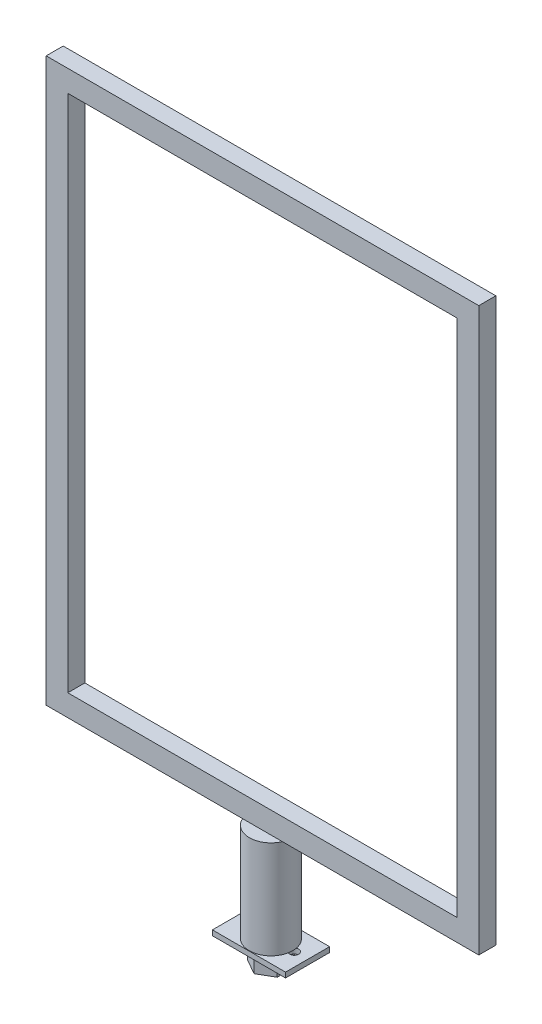
ISO-10303-21;
HEADER;
FILE_DESCRIPTION(('STEP AP214'),'2;1');
FILE_NAME('part.step','',(''),(''),'','','');
FILE_SCHEMA(('AUTOMOTIVE_DESIGN { 1 0 10303 214 1 1 1 1 }'));
ENDSEC;
DATA;
#1=APPLICATION_CONTEXT('core data for automotive mechanical design processes');
#2=APPLICATION_PROTOCOL_DEFINITION('international standard','automotive_design',2000,#1);
#3=PRODUCT_CONTEXT('',#1,'mechanical');
#4=PRODUCT('Part','Part','',(#3));
#5=PRODUCT_RELATED_PRODUCT_CATEGORY('part','',(#4));
#6=PRODUCT_DEFINITION_FORMATION('','',#4);
#7=PRODUCT_DEFINITION_CONTEXT('part definition',#1,'design');
#8=PRODUCT_DEFINITION('design','',#6,#7);
#9=PRODUCT_DEFINITION_SHAPE('','',#8);
#10=(LENGTH_UNIT() NAMED_UNIT(*) SI_UNIT(.MILLI.,.METRE.));
#11=(NAMED_UNIT(*) PLANE_ANGLE_UNIT() SI_UNIT($,.RADIAN.));
#12=(NAMED_UNIT(*) SI_UNIT($,.STERADIAN.) SOLID_ANGLE_UNIT());
#13=UNCERTAINTY_MEASURE_WITH_UNIT(LENGTH_MEASURE(1.E-05),#10,'distance_accuracy_value','');
#14=(GEOMETRIC_REPRESENTATION_CONTEXT(3) GLOBAL_UNCERTAINTY_ASSIGNED_CONTEXT((#13)) GLOBAL_UNIT_ASSIGNED_CONTEXT((#10,
#11,#12)) REPRESENTATION_CONTEXT('',''));
#15=CARTESIAN_POINT('',(0.,0.,0.));
#16=DIRECTION('',(0.,0.,1.));
#17=DIRECTION('',(1.,0.,0.));
#18=AXIS2_PLACEMENT_3D('',#15,#16,#17);
#19=CARTESIAN_POINT('',(0.,70.47647,0.));
#20=DIRECTION('',(0.,1.,0.));
#21=DIRECTION('',(0.,0.,1.));
#22=AXIS2_PLACEMENT_3D('',#19,#20,#21);
#23=PLANE('',#22);
#24=CARTESIAN_POINT('',(0.,70.47647,0.));
#25=DIRECTION('',(0.,1.,0.));
#26=DIRECTION('',(0.,0.,1.));
#27=AXIS2_PLACEMENT_3D('',#24,#25,#26);
#28=CIRCLE('',#27,12.7);
#29=CARTESIAN_POINT('',(11.6743308159397,70.47647,-5.));
#30=VERTEX_POINT('',#29);
#31=CARTESIAN_POINT('',(-11.6743308159397,70.47647,-5.));
#32=VERTEX_POINT('',#31);
#33=EDGE_CURVE('E269',#30,#32,#28,.T.);
#34=ORIENTED_EDGE('',*,*,#33,.T.);
#35=DIRECTION('',(1.,0.,0.));
#36=VECTOR('',#35,1.);
#37=CARTESIAN_POINT('',(-127.,70.47647,-5.));
#38=LINE('',#37,#36);
#39=EDGE_CURVE('E46',#32,#30,#38,.T.);
#40=ORIENTED_EDGE('',*,*,#39,.T.);
#41=EDGE_LOOP('',(#34,#40));
#42=FACE_BOUND('',#41,.T.);
#43=ADVANCED_FACE('F37',(#42),#23,.T.);
#44=CARTESIAN_POINT('',(8.66025403784433,10.,-5.0000000000001));
#45=DIRECTION('',(-0.499999999999995,0.,0.866025403784442));
#46=DIRECTION('',(0.866025403784442,0.,0.499999999999995));
#47=AXIS2_PLACEMENT_3D('',#44,#45,#46);
#48=PLANE('',#47);
#49=DIRECTION('',(-0.866025403784442,0.,-0.499999999999995));
#50=VECTOR('',#49,1.);
#51=CARTESIAN_POINT('',(8.66025403784433,0.,-5.0000000000001));
#52=LINE('',#51,#50);
#53=CARTESIAN_POINT('',(8.66025403784433,0.,-5.0000000000001));
#54=VERTEX_POINT('',#53);
#55=CARTESIAN_POINT('',(0.,0.,-10.));
#56=VERTEX_POINT('',#55);
#57=EDGE_CURVE('E317',#54,#56,#52,.T.);
#58=ORIENTED_EDGE('',*,*,#57,.T.);
#59=DIRECTION('',(0.,-1.,0.));
#60=VECTOR('',#59,1.);
#61=CARTESIAN_POINT('',(0.,10.,-10.));
#62=LINE('',#61,#60);
#63=CARTESIAN_POINT('',(0.,10.,-10.));
#64=VERTEX_POINT('',#63);
#65=EDGE_CURVE('E41',#64,#56,#62,.T.);
#66=ORIENTED_EDGE('',*,*,#65,.F.);
#67=DIRECTION('',(-0.866025403784442,0.,-0.499999999999995));
#68=VECTOR('',#67,1.);
#69=CARTESIAN_POINT('',(8.66025403784433,10.,-5.0000000000001));
#70=LINE('',#69,#68);
#71=CARTESIAN_POINT('',(8.66025403784433,10.,-5.0000000000001));
#72=VERTEX_POINT('',#71);
#73=EDGE_CURVE('E318',#72,#64,#70,.T.);
#74=ORIENTED_EDGE('',*,*,#73,.F.);
#75=DIRECTION('',(0.,-1.,0.));
#76=VECTOR('',#75,1.);
#77=CARTESIAN_POINT('',(8.66025403784433,10.,-5.0000000000001));
#78=LINE('',#77,#76);
#79=EDGE_CURVE('E337',#72,#54,#78,.T.);
#80=ORIENTED_EDGE('',*,*,#79,.T.);
#81=EDGE_LOOP('',(#58,#66,#74,#80));
#82=FACE_BOUND('',#81,.T.);
#83=ADVANCED_FACE('F39',(#82),#48,.F.);
#84=CARTESIAN_POINT('',(0.,10.,-10.));
#85=DIRECTION('',(0.500000000000001,0.,0.866025403784438));
#86=DIRECTION('',(0.866025403784438,0.,-0.500000000000001));
#87=AXIS2_PLACEMENT_3D('',#84,#85,#86);
#88=PLANE('',#87);
#89=DIRECTION('',(-0.866025403784438,0.,0.500000000000001));
#90=VECTOR('',#89,1.);
#91=CARTESIAN_POINT('',(0.,0.,-10.));
#92=LINE('',#91,#90);
#93=CARTESIAN_POINT('',(-8.6602540378444,0.,-4.99999999999998));
#94=VERTEX_POINT('',#93);
#95=EDGE_CURVE('E340',#56,#94,#92,.T.);
#96=ORIENTED_EDGE('',*,*,#95,.T.);
#97=DIRECTION('',(0.,-1.,0.));
#98=VECTOR('',#97,1.);
#99=CARTESIAN_POINT('',(-8.6602540378444,10.,-4.99999999999998));
#100=LINE('',#99,#98);
#101=CARTESIAN_POINT('',(-8.6602540378444,10.,-4.99999999999998));
#102=VERTEX_POINT('',#101);
#103=EDGE_CURVE('E359',#102,#94,#100,.T.);
#104=ORIENTED_EDGE('',*,*,#103,.F.);
#105=DIRECTION('',(-0.866025403784438,0.,0.500000000000001));
#106=VECTOR('',#105,1.);
#107=CARTESIAN_POINT('',(0.,10.,-10.));
#108=LINE('',#107,#106);
#109=EDGE_CURVE('E321',#64,#102,#108,.T.);
#110=ORIENTED_EDGE('',*,*,#109,.F.);
#111=ORIENTED_EDGE('',*,*,#65,.T.);
#112=EDGE_LOOP('',(#96,#104,#110,#111));
#113=FACE_BOUND('',#112,.T.);
#114=ADVANCED_FACE('F412',(#113),#88,.F.);
#115=CARTESIAN_POINT('',(-8.6602540378444,10.,-4.99999999999998));
#116=DIRECTION('',(1.,0.,0.));
#117=DIRECTION('',(0.,0.,-1.));
#118=AXIS2_PLACEMENT_3D('',#115,#116,#117);
#119=PLANE('',#118);
#120=DIRECTION('',(0.,0.,1.));
#121=VECTOR('',#120,1.);
#122=CARTESIAN_POINT('',(-8.6602540378444,0.,-4.99999999999998));
#123=LINE('',#122,#121);
#124=CARTESIAN_POINT('',(-8.66025403784436,0.,5.00000000000004));
#125=VERTEX_POINT('',#124);
#126=EDGE_CURVE('E342',#94,#125,#123,.T.);
#127=ORIENTED_EDGE('',*,*,#126,.T.);
#128=DIRECTION('',(0.,-1.,0.));
#129=VECTOR('',#128,1.);
#130=CARTESIAN_POINT('',(-8.66025403784436,10.,5.00000000000004));
#131=LINE('',#130,#129);
#132=CARTESIAN_POINT('',(-8.66025403784436,10.,5.00000000000004));
#133=VERTEX_POINT('',#132);
#134=EDGE_CURVE('E357',#133,#125,#131,.T.);
#135=ORIENTED_EDGE('',*,*,#134,.F.);
#136=DIRECTION('',(0.,0.,1.));
#137=VECTOR('',#136,1.);
#138=CARTESIAN_POINT('',(-8.6602540378444,10.,-4.99999999999998));
#139=LINE('',#138,#137);
#140=EDGE_CURVE('E325',#102,#133,#139,.T.);
#141=ORIENTED_EDGE('',*,*,#140,.F.);
#142=ORIENTED_EDGE('',*,*,#103,.T.);
#143=EDGE_LOOP('',(#127,#135,#141,#142));
#144=FACE_BOUND('',#143,.T.);
#145=ADVANCED_FACE('F508',(#144),#119,.F.);
#146=CARTESIAN_POINT('',(-8.66025403784436,10.,5.00000000000004));
#147=DIRECTION('',(0.499999999999995,0.,-0.866025403784441));
#148=DIRECTION('',(-0.866025403784441,0.,-0.499999999999995));
#149=AXIS2_PLACEMENT_3D('',#146,#147,#148);
#150=PLANE('',#149);
#151=DIRECTION('',(0.866025403784441,0.,0.499999999999995));
#152=VECTOR('',#151,1.);
#153=CARTESIAN_POINT('',(-8.66025403784436,0.,5.00000000000004));
#154=LINE('',#153,#152);
#155=CARTESIAN_POINT('',(0.,0.,10.));
#156=VERTEX_POINT('',#155);
#157=EDGE_CURVE('E344',#125,#156,#154,.T.);
#158=ORIENTED_EDGE('',*,*,#157,.T.);
#159=DIRECTION('',(0.,-1.,0.));
#160=VECTOR('',#159,1.);
#161=CARTESIAN_POINT('',(0.,10.,10.));
#162=LINE('',#161,#160);
#163=CARTESIAN_POINT('',(0.,10.,10.));
#164=VERTEX_POINT('',#163);
#165=EDGE_CURVE('E354',#164,#156,#162,.T.);
#166=ORIENTED_EDGE('',*,*,#165,.F.);
#167=DIRECTION('',(0.866025403784441,0.,0.499999999999995));
#168=VECTOR('',#167,1.);
#169=CARTESIAN_POINT('',(-8.66025403784436,10.,5.00000000000004));
#170=LINE('',#169,#168);
#171=EDGE_CURVE('E328',#133,#164,#170,.T.);
#172=ORIENTED_EDGE('',*,*,#171,.F.);
#173=ORIENTED_EDGE('',*,*,#134,.T.);
#174=EDGE_LOOP('',(#158,#166,#172,#173));
#175=FACE_BOUND('',#174,.T.);
#176=ADVANCED_FACE('F504',(#175),#150,.F.);
#177=CARTESIAN_POINT('',(0.,10.,10.));
#178=DIRECTION('',(-0.500000000000007,0.,-0.866025403784434));
#179=DIRECTION('',(-0.866025403784435,0.,0.500000000000007));
#180=AXIS2_PLACEMENT_3D('',#177,#178,#179);
#181=PLANE('',#180);
#182=DIRECTION('',(0.866025403784434,0.,-0.500000000000007));
#183=VECTOR('',#182,1.);
#184=CARTESIAN_POINT('',(0.,0.,10.));
#185=LINE('',#184,#183);
#186=CARTESIAN_POINT('',(8.66025403784443,0.,4.99999999999992));
#187=VERTEX_POINT('',#186);
#188=EDGE_CURVE('E346',#156,#187,#185,.T.);
#189=ORIENTED_EDGE('',*,*,#188,.T.);
#190=DIRECTION('',(0.,-1.,0.));
#191=VECTOR('',#190,1.);
#192=CARTESIAN_POINT('',(8.66025403784443,10.,4.99999999999992));
#193=LINE('',#192,#191);
#194=CARTESIAN_POINT('',(8.66025403784443,10.,4.99999999999992));
#195=VERTEX_POINT('',#194);
#196=EDGE_CURVE('E351',#195,#187,#193,.T.);
#197=ORIENTED_EDGE('',*,*,#196,.F.);
#198=DIRECTION('',(0.866025403784434,0.,-0.500000000000007));
#199=VECTOR('',#198,1.);
#200=CARTESIAN_POINT('',(0.,10.,10.));
#201=LINE('',#200,#199);
#202=EDGE_CURVE('E331',#164,#195,#201,.T.);
#203=ORIENTED_EDGE('',*,*,#202,.F.);
#204=ORIENTED_EDGE('',*,*,#165,.T.);
#205=EDGE_LOOP('',(#189,#197,#203,#204));
#206=FACE_BOUND('',#205,.T.);
#207=ADVANCED_FACE('F500',(#206),#181,.F.);
#208=CARTESIAN_POINT('',(8.66025403784443,10.,4.99999999999992));
#209=DIRECTION('',(-1.,0.,0.));
#210=DIRECTION('',(0.,0.,1.));
#211=AXIS2_PLACEMENT_3D('',#208,#209,#210);
#212=PLANE('',#211);
#213=DIRECTION('',(0.,0.,-1.));
#214=VECTOR('',#213,1.);
#215=CARTESIAN_POINT('',(8.66025403784443,0.,4.99999999999992));
#216=LINE('',#215,#214);
#217=EDGE_CURVE('E322',#187,#54,#216,.T.);
#218=ORIENTED_EDGE('',*,*,#217,.T.);
#219=ORIENTED_EDGE('',*,*,#79,.F.);
#220=DIRECTION('',(0.,0.,-1.));
#221=VECTOR('',#220,1.);
#222=CARTESIAN_POINT('',(8.66025403784443,10.,4.99999999999992));
#223=LINE('',#222,#221);
#224=EDGE_CURVE('E334',#195,#72,#223,.T.);
#225=ORIENTED_EDGE('',*,*,#224,.F.);
#226=ORIENTED_EDGE('',*,*,#196,.T.);
#227=EDGE_LOOP('',(#218,#219,#225,#226));
#228=FACE_BOUND('',#227,.T.);
#229=ADVANCED_FACE('F496',(#228),#212,.F.);
#230=CARTESIAN_POINT('',(0.,0.,0.));
#231=DIRECTION('',(0.,1.,0.));
#232=DIRECTION('',(0.,0.,1.));
#233=AXIS2_PLACEMENT_3D('',#230,#231,#232);
#234=PLANE('',#233);
#235=ORIENTED_EDGE('',*,*,#57,.F.);
#236=ORIENTED_EDGE('',*,*,#217,.F.);
#237=ORIENTED_EDGE('',*,*,#188,.F.);
#238=ORIENTED_EDGE('',*,*,#157,.F.);
#239=ORIENTED_EDGE('',*,*,#126,.F.);
#240=ORIENTED_EDGE('',*,*,#95,.F.);
#241=EDGE_LOOP('',(#235,#236,#237,#238,#239,#240));
#242=FACE_BOUND('',#241,.T.);
#243=ADVANCED_FACE('F476',(#242),#234,.F.);
#244=CARTESIAN_POINT('',(0.,13.,0.));
#245=DIRECTION('',(0.,-1.,0.));
#246=DIRECTION('',(0.,0.,-1.));
#247=AXIS2_PLACEMENT_3D('',#244,#245,#246);
#248=PLANE('',#247);
#249=CARTESIAN_POINT('',(0.,13.,0.));
#250=DIRECTION('',(0.,1.,0.));
#251=DIRECTION('',(0.,0.,1.));
#252=AXIS2_PLACEMENT_3D('',#249,#250,#251);
#253=CIRCLE('',#252,12.7);
#254=CARTESIAN_POINT('',(12.4863175836031,13.,-2.31988646304155));
#255=VERTEX_POINT('',#254);
#256=CARTESIAN_POINT('',(-12.4863175836031,13.,-2.31988646304155));
#257=VERTEX_POINT('',#256);
#258=EDGE_CURVE('E64',#255,#257,#253,.T.);
#259=ORIENTED_EDGE('',*,*,#258,.F.);
#260=CARTESIAN_POINT('',(13.6602540378444,13.,0.));
#261=DIRECTION('',(0.,1.,0.));
#262=DIRECTION('',(0.,0.,-1.));
#263=AXIS2_PLACEMENT_3D('',#260,#261,#262);
#264=CIRCLE('',#263,2.6);
#265=CARTESIAN_POINT('',(12.4863175836031,13.,2.31988646304155));
#266=VERTEX_POINT('',#265);
#267=EDGE_CURVE('E278',#266,#255,#264,.T.);
#268=ORIENTED_EDGE('',*,*,#267,.F.);
#269=CARTESIAN_POINT('',(-12.4863175836031,13.,2.31988646304155));
#270=VERTEX_POINT('',#269);
#271=EDGE_CURVE('E274',#270,#266,#253,.T.);
#272=ORIENTED_EDGE('',*,*,#271,.F.);
#273=CARTESIAN_POINT('',(-13.6602540378444,13.,0.));
#274=DIRECTION('',(0.,1.,0.));
#275=DIRECTION('',(0.,0.,1.));
#276=AXIS2_PLACEMENT_3D('',#273,#274,#275);
#277=CIRCLE('',#276,2.6);
#278=EDGE_CURVE('E285',#257,#270,#277,.T.);
#279=ORIENTED_EDGE('',*,*,#278,.F.);
#280=EDGE_LOOP('',(#259,#268,#272,#279));
#281=FACE_BOUND('',#280,.T.);
#282=DIRECTION('',(0.,0.,-1.));
#283=VECTOR('',#282,1.);
#284=CARTESIAN_POINT('',(21.4724680294263,13.,12.9315023116513));
#285=LINE('',#284,#283);
#286=CARTESIAN_POINT('',(21.4724680294263,13.,12.9315023116513));
#287=VERTEX_POINT('',#286);
#288=CARTESIAN_POINT('',(21.4724680294263,13.,-12.9315023116513));
#289=VERTEX_POINT('',#288);
#290=EDGE_CURVE('E288',#287,#289,#285,.T.);
#291=ORIENTED_EDGE('',*,*,#290,.T.);
#292=DIRECTION('',(-1.,0.,0.));
#293=VECTOR('',#292,1.);
#294=CARTESIAN_POINT('',(-21.4724680294263,13.,-12.9315023116513));
#295=LINE('',#294,#293);
#296=CARTESIAN_POINT('',(-21.4724680294263,13.,-12.9315023116513));
#297=VERTEX_POINT('',#296);
#298=EDGE_CURVE('E291',#289,#297,#295,.T.);
#299=ORIENTED_EDGE('',*,*,#298,.T.);
#300=DIRECTION('',(0.,0.,1.));
#301=VECTOR('',#300,1.);
#302=CARTESIAN_POINT('',(-21.4724680294263,13.,12.9315023116513));
#303=LINE('',#302,#301);
#304=CARTESIAN_POINT('',(-21.4724680294263,13.,12.9315023116513));
#305=VERTEX_POINT('',#304);
#306=EDGE_CURVE('E294',#297,#305,#303,.T.);
#307=ORIENTED_EDGE('',*,*,#306,.T.);
#308=DIRECTION('',(1.,0.,0.));
#309=VECTOR('',#308,1.);
#310=CARTESIAN_POINT('',(-21.4724680294263,13.,12.9315023116513));
#311=LINE('',#310,#309);
#312=EDGE_CURVE('E296',#305,#287,#311,.T.);
#313=ORIENTED_EDGE('',*,*,#312,.T.);
#314=EDGE_LOOP('',(#291,#299,#307,#313));
#315=FACE_BOUND('',#314,.T.);
#316=ADVANCED_FACE('F381',(#281,#315),#248,.F.);
#317=CARTESIAN_POINT('',(0.,10.,0.));
#318=DIRECTION('',(0.,-1.,0.));
#319=DIRECTION('',(0.,0.,-1.));
#320=AXIS2_PLACEMENT_3D('',#317,#318,#319);
#321=PLANE('',#320);
#322=ORIENTED_EDGE('',*,*,#224,.T.);
#323=ORIENTED_EDGE('',*,*,#73,.T.);
#324=ORIENTED_EDGE('',*,*,#109,.T.);
#325=ORIENTED_EDGE('',*,*,#140,.T.);
#326=ORIENTED_EDGE('',*,*,#171,.T.);
#327=ORIENTED_EDGE('',*,*,#202,.T.);
#328=EDGE_LOOP('',(#322,#323,#324,#325,#326,#327));
#329=FACE_BOUND('',#328,.T.);
#330=CARTESIAN_POINT('',(-13.6602540378444,10.,0.));
#331=DIRECTION('',(0.,1.,0.));
#332=DIRECTION('',(0.,0.,1.));
#333=AXIS2_PLACEMENT_3D('',#330,#331,#332);
#334=CIRCLE('',#333,2.6);
#335=CARTESIAN_POINT('',(-13.6602540378444,10.,2.6));
#336=VERTEX_POINT('',#335);
#337=EDGE_CURVE('E277',#336,#336,#334,.T.);
#338=ORIENTED_EDGE('',*,*,#337,.T.);
#339=EDGE_LOOP('',(#338));
#340=FACE_BOUND('',#339,.T.);
#341=DIRECTION('',(0.,0.,-1.));
#342=VECTOR('',#341,1.);
#343=CARTESIAN_POINT('',(21.4724680294263,10.,12.9315023116513));
#344=LINE('',#343,#342);
#345=CARTESIAN_POINT('',(21.4724680294263,10.,12.9315023116513));
#346=VERTEX_POINT('',#345);
#347=CARTESIAN_POINT('',(21.4724680294263,10.,-12.9315023116513));
#348=VERTEX_POINT('',#347);
#349=EDGE_CURVE('E284',#346,#348,#344,.T.);
#350=ORIENTED_EDGE('',*,*,#349,.F.);
#351=DIRECTION('',(1.,0.,0.));
#352=VECTOR('',#351,1.);
#353=CARTESIAN_POINT('',(-21.4724680294263,10.,12.9315023116513));
#354=LINE('',#353,#352);
#355=CARTESIAN_POINT('',(-21.4724680294263,10.,12.9315023116513));
#356=VERTEX_POINT('',#355);
#357=EDGE_CURVE('E292',#356,#346,#354,.T.);
#358=ORIENTED_EDGE('',*,*,#357,.F.);
#359=DIRECTION('',(0.,0.,1.));
#360=VECTOR('',#359,1.);
#361=CARTESIAN_POINT('',(-21.4724680294263,10.,12.9315023116513));
#362=LINE('',#361,#360);
#363=CARTESIAN_POINT('',(-21.4724680294263,10.,-12.9315023116513));
#364=VERTEX_POINT('',#363);
#365=EDGE_CURVE('E303',#364,#356,#362,.T.);
#366=ORIENTED_EDGE('',*,*,#365,.F.);
#367=DIRECTION('',(-1.,0.,0.));
#368=VECTOR('',#367,1.);
#369=CARTESIAN_POINT('',(-21.4724680294263,10.,-12.9315023116513));
#370=LINE('',#369,#368);
#371=EDGE_CURVE('E301',#348,#364,#370,.T.);
#372=ORIENTED_EDGE('',*,*,#371,.F.);
#373=EDGE_LOOP('',(#350,#358,#366,#372));
#374=FACE_BOUND('',#373,.T.);
#375=CARTESIAN_POINT('',(13.6602540378444,10.,0.));
#376=DIRECTION('',(0.,1.,0.));
#377=DIRECTION('',(0.,0.,-1.));
#378=AXIS2_PLACEMENT_3D('',#375,#376,#377);
#379=CIRCLE('',#378,2.6);
#380=CARTESIAN_POINT('',(13.6602540378444,10.,-2.6));
#381=VERTEX_POINT('',#380);
#382=EDGE_CURVE('E268',#381,#381,#379,.T.);
#383=ORIENTED_EDGE('',*,*,#382,.T.);
#384=EDGE_LOOP('',(#383));
#385=FACE_BOUND('',#384,.T.);
#386=ADVANCED_FACE('F475',(#329,#340,#374,#385),#321,.T.);
#387=CARTESIAN_POINT('',(21.4724680294263,13.,12.9315023116513));
#388=DIRECTION('',(-1.,0.,0.));
#389=DIRECTION('',(0.,0.,1.));
#390=AXIS2_PLACEMENT_3D('',#387,#388,#389);
#391=PLANE('',#390);
#392=ORIENTED_EDGE('',*,*,#349,.T.);
#393=DIRECTION('',(0.,-1.,0.));
#394=VECTOR('',#393,1.);
#395=CARTESIAN_POINT('',(21.4724680294263,13.,-12.9315023116513));
#396=LINE('',#395,#394);
#397=EDGE_CURVE('E314',#289,#348,#396,.T.);
#398=ORIENTED_EDGE('',*,*,#397,.F.);
#399=ORIENTED_EDGE('',*,*,#290,.F.);
#400=DIRECTION('',(0.,-1.,0.));
#401=VECTOR('',#400,1.);
#402=CARTESIAN_POINT('',(21.4724680294263,13.,12.9315023116513));
#403=LINE('',#402,#401);
#404=EDGE_CURVE('E298',#287,#346,#403,.T.);
#405=ORIENTED_EDGE('',*,*,#404,.T.);
#406=EDGE_LOOP('',(#392,#398,#399,#405));
#407=FACE_BOUND('',#406,.T.);
#408=ADVANCED_FACE('F479',(#407),#391,.F.);
#409=CARTESIAN_POINT('',(-21.4724680294263,13.,-12.9315023116513));
#410=DIRECTION('',(0.,0.,1.));
#411=DIRECTION('',(1.,0.,0.));
#412=AXIS2_PLACEMENT_3D('',#409,#410,#411);
#413=PLANE('',#412);
#414=ORIENTED_EDGE('',*,*,#371,.T.);
#415=DIRECTION('',(0.,-1.,0.));
#416=VECTOR('',#415,1.);
#417=CARTESIAN_POINT('',(-21.4724680294263,13.,-12.9315023116513));
#418=LINE('',#417,#416);
#419=EDGE_CURVE('E311',#297,#364,#418,.T.);
#420=ORIENTED_EDGE('',*,*,#419,.F.);
#421=ORIENTED_EDGE('',*,*,#298,.F.);
#422=ORIENTED_EDGE('',*,*,#397,.T.);
#423=EDGE_LOOP('',(#414,#420,#421,#422));
#424=FACE_BOUND('',#423,.T.);
#425=ADVANCED_FACE('F487',(#424),#413,.F.);
#426=CARTESIAN_POINT('',(-21.4724680294263,13.,12.9315023116513));
#427=DIRECTION('',(1.,0.,0.));
#428=DIRECTION('',(0.,0.,-1.));
#429=AXIS2_PLACEMENT_3D('',#426,#427,#428);
#430=PLANE('',#429);
#431=ORIENTED_EDGE('',*,*,#365,.T.);
#432=DIRECTION('',(0.,-1.,0.));
#433=VECTOR('',#432,1.);
#434=CARTESIAN_POINT('',(-21.4724680294263,13.,12.9315023116513));
#435=LINE('',#434,#433);
#436=EDGE_CURVE('E308',#305,#356,#435,.T.);
#437=ORIENTED_EDGE('',*,*,#436,.F.);
#438=ORIENTED_EDGE('',*,*,#306,.F.);
#439=ORIENTED_EDGE('',*,*,#419,.T.);
#440=EDGE_LOOP('',(#431,#437,#438,#439));
#441=FACE_BOUND('',#440,.T.);
#442=ADVANCED_FACE('F483',(#441),#430,.F.);
#443=CARTESIAN_POINT('',(-21.4724680294263,13.,12.9315023116513));
#444=DIRECTION('',(0.,0.,-1.));
#445=DIRECTION('',(-1.,0.,0.));
#446=AXIS2_PLACEMENT_3D('',#443,#444,#445);
#447=PLANE('',#446);
#448=ORIENTED_EDGE('',*,*,#357,.T.);
#449=ORIENTED_EDGE('',*,*,#404,.F.);
#450=ORIENTED_EDGE('',*,*,#312,.F.);
#451=ORIENTED_EDGE('',*,*,#436,.T.);
#452=EDGE_LOOP('',(#448,#449,#450,#451));
#453=FACE_BOUND('',#452,.T.);
#454=ADVANCED_FACE('F473',(#453),#447,.F.);
#455=CARTESIAN_POINT('',(-13.6602540378444,13.,0.));
#456=DIRECTION('',(0.,-1.,0.));
#457=DIRECTION('',(0.,0.,-1.));
#458=AXIS2_PLACEMENT_3D('',#455,#456,#457);
#459=CYLINDRICAL_SURFACE('',#458,2.6);
#460=EDGE_CURVE('E281',#270,#257,#277,.T.);
#461=ORIENTED_EDGE('',*,*,#460,.T.);
#462=ORIENTED_EDGE('',*,*,#278,.T.);
#463=EDGE_LOOP('',(#461,#462));
#464=FACE_BOUND('',#463,.T.);
#465=ORIENTED_EDGE('',*,*,#337,.F.);
#466=EDGE_LOOP('',(#465));
#467=FACE_BOUND('',#466,.T.);
#468=ADVANCED_FACE('F379',(#464,#467),#459,.F.);
#469=CARTESIAN_POINT('',(13.6602540378444,13.,0.));
#470=DIRECTION('',(0.,-1.,0.));
#471=DIRECTION('',(0.,0.,-1.));
#472=AXIS2_PLACEMENT_3D('',#469,#470,#471);
#473=CYLINDRICAL_SURFACE('',#472,2.6);
#474=EDGE_CURVE('E275',#255,#266,#264,.T.);
#475=ORIENTED_EDGE('',*,*,#474,.T.);
#476=ORIENTED_EDGE('',*,*,#267,.T.);
#477=EDGE_LOOP('',(#475,#476));
#478=FACE_BOUND('',#477,.T.);
#479=ORIENTED_EDGE('',*,*,#382,.F.);
#480=EDGE_LOOP('',(#479));
#481=FACE_BOUND('',#480,.T.);
#482=ADVANCED_FACE('F385',(#478,#481),#473,.F.);
#483=CARTESIAN_POINT('',(0.,13.,0.));
#484=DIRECTION('',(0.,1.,0.));
#485=DIRECTION('',(0.,0.,1.));
#486=AXIS2_PLACEMENT_3D('',#483,#484,#485);
#487=PLANE('',#486);
#488=ORIENTED_EDGE('',*,*,#460,.F.);
#489=EDGE_CURVE('E260',#257,#270,#253,.T.);
#490=ORIENTED_EDGE('',*,*,#489,.F.);
#491=EDGE_LOOP('',(#488,#490));
#492=FACE_BOUND('',#491,.T.);
#493=ADVANCED_FACE('F376',(#492),#487,.F.);
#494=CARTESIAN_POINT('',(0.,70.47647,0.));
#495=DIRECTION('',(0.,-1.,0.));
#496=DIRECTION('',(0.,0.,-1.));
#497=AXIS2_PLACEMENT_3D('',#494,#495,#496);
#498=CYLINDRICAL_SURFACE('',#497,12.7);
#499=CARTESIAN_POINT('',(11.6743308159397,70.47647,5.));
#500=VERTEX_POINT('',#499);
#501=EDGE_CURVE('E266',#500,#30,#28,.T.);
#502=ORIENTED_EDGE('',*,*,#501,.F.);
#503=CARTESIAN_POINT('',(-11.6743308159397,70.47647,5.));
#504=VERTEX_POINT('',#503);
#505=EDGE_CURVE('E270',#504,#500,#28,.T.);
#506=ORIENTED_EDGE('',*,*,#505,.F.);
#507=EDGE_CURVE('E458',#32,#504,#28,.T.);
#508=ORIENTED_EDGE('',*,*,#507,.F.);
#509=ORIENTED_EDGE('',*,*,#33,.F.);
#510=EDGE_LOOP('',(#502,#506,#508,#509));
#511=FACE_BOUND('',#510,.T.);
#512=EDGE_CURVE('E271',#266,#255,#253,.T.);
#513=ORIENTED_EDGE('',*,*,#512,.T.);
#514=ORIENTED_EDGE('',*,*,#258,.T.);
#515=ORIENTED_EDGE('',*,*,#489,.T.);
#516=ORIENTED_EDGE('',*,*,#271,.T.);
#517=EDGE_LOOP('',(#513,#514,#515,#516));
#518=FACE_BOUND('',#517,.T.);
#519=ADVANCED_FACE('F373',(#511,#518),#498,.T.);
#520=DIRECTION('',(1.,0.,0.));
#521=VECTOR('',#520,1.);
#522=CARTESIAN_POINT('',(-127.,70.47647,5.));
#523=LINE('',#522,#521);
#524=EDGE_CURVE('E11',#504,#500,#523,.T.);
#525=ORIENTED_EDGE('',*,*,#524,.F.);
#526=ORIENTED_EDGE('',*,*,#505,.T.);
#527=EDGE_LOOP('',(#525,#526));
#528=FACE_BOUND('',#527,.T.);
#529=ADVANCED_FACE('F391',(#528),#23,.T.);
#530=ORIENTED_EDGE('',*,*,#474,.F.);
#531=ORIENTED_EDGE('',*,*,#512,.F.);
#532=EDGE_LOOP('',(#530,#531));
#533=FACE_BOUND('',#532,.T.);
#534=ADVANCED_FACE('F388',(#533),#487,.F.);
#535=CARTESIAN_POINT('',(-127.,70.47647,-5.));
#536=DIRECTION('',(0.,-1.,0.));
#537=DIRECTION('',(0.,0.,-1.));
#538=AXIS2_PLACEMENT_3D('',#535,#536,#537);
#539=PLANE('',#538);
#540=CARTESIAN_POINT('',(127.,70.47647,5.));
#541=VERTEX_POINT('',#540);
#542=EDGE_CURVE('E49',#500,#541,#523,.T.);
#543=ORIENTED_EDGE('',*,*,#542,.F.);
#544=ORIENTED_EDGE('',*,*,#501,.T.);
#545=CARTESIAN_POINT('',(127.,70.47647,-5.));
#546=VERTEX_POINT('',#545);
#547=EDGE_CURVE('E56',#30,#546,#38,.T.);
#548=ORIENTED_EDGE('',*,*,#547,.T.);
#549=DIRECTION('',(0.,0.,1.));
#550=VECTOR('',#549,1.);
#551=CARTESIAN_POINT('',(127.,70.47647,-5.));
#552=LINE('',#551,#550);
#553=EDGE_CURVE('E257',#546,#541,#552,.T.);
#554=ORIENTED_EDGE('',*,*,#553,.T.);
#555=EDGE_LOOP('',(#543,#544,#548,#554));
#556=FACE_BOUND('',#555,.T.);
#557=ADVANCED_FACE('F390',(#556),#539,.T.);
#558=CARTESIAN_POINT('',(127.,70.47647,-5.));
#559=DIRECTION('',(1.,0.,0.));
#560=DIRECTION('',(0.,1.,0.));
#561=AXIS2_PLACEMENT_3D('',#558,#559,#560);
#562=PLANE('',#561);
#563=DIRECTION('',(0.,0.,1.));
#564=VECTOR('',#563,1.);
#565=CARTESIAN_POINT('',(127.,400.676470000002,-5.));
#566=LINE('',#565,#564);
#567=CARTESIAN_POINT('',(127.,400.676470000002,-5.));
#568=VERTEX_POINT('',#567);
#569=CARTESIAN_POINT('',(127.,400.676470000002,5.));
#570=VERTEX_POINT('',#569);
#571=EDGE_CURVE('E256',#568,#570,#566,.T.);
#572=ORIENTED_EDGE('',*,*,#571,.T.);
#573=DIRECTION('',(0.,1.,0.));
#574=VECTOR('',#573,1.);
#575=CARTESIAN_POINT('',(127.,70.47647,5.));
#576=LINE('',#575,#574);
#577=EDGE_CURVE('E222',#541,#570,#576,.T.);
#578=ORIENTED_EDGE('',*,*,#577,.F.);
#579=ORIENTED_EDGE('',*,*,#553,.F.);
#580=DIRECTION('',(0.,1.,0.));
#581=VECTOR('',#580,1.);
#582=CARTESIAN_POINT('',(127.,70.47647,-5.));
#583=LINE('',#582,#581);
#584=EDGE_CURVE('E241',#546,#568,#583,.T.);
#585=ORIENTED_EDGE('',*,*,#584,.T.);
#586=EDGE_LOOP('',(#572,#578,#579,#585));
#587=FACE_BOUND('',#586,.T.);
#588=ADVANCED_FACE('F397',(#587),#562,.T.);
#589=CARTESIAN_POINT('',(-127.,70.47647,-5.));
#590=VERTEX_POINT('',#589);
#591=EDGE_CURVE('E253',#590,#32,#38,.T.);
#592=ORIENTED_EDGE('',*,*,#591,.T.);
#593=ORIENTED_EDGE('',*,*,#507,.T.);
#594=CARTESIAN_POINT('',(-127.,70.47647,5.));
#595=VERTEX_POINT('',#594);
#596=EDGE_CURVE('E48',#595,#504,#523,.T.);
#597=ORIENTED_EDGE('',*,*,#596,.F.);
#598=DIRECTION('',(0.,0.,1.));
#599=VECTOR('',#598,1.);
#600=CARTESIAN_POINT('',(-127.,70.47647,-5.));
#601=LINE('',#600,#599);
#602=EDGE_CURVE('E261',#590,#595,#601,.T.);
#603=ORIENTED_EDGE('',*,*,#602,.F.);
#604=EDGE_LOOP('',(#592,#593,#597,#603));
#605=FACE_BOUND('',#604,.T.);
#606=ADVANCED_FACE('F400',(#605),#539,.T.);
#607=CARTESIAN_POINT('',(-127.,70.47647,-5.));
#608=DIRECTION('',(-1.,0.,0.));
#609=DIRECTION('',(0.,0.,1.));
#610=AXIS2_PLACEMENT_3D('',#607,#608,#609);
#611=PLANE('',#610);
#612=ORIENTED_EDGE('',*,*,#602,.T.);
#613=DIRECTION('',(0.,-1.,0.));
#614=VECTOR('',#613,1.);
#615=CARTESIAN_POINT('',(-127.,70.47647,5.));
#616=LINE('',#615,#614);
#617=CARTESIAN_POINT('',(-127.,400.676470000002,5.));
#618=VERTEX_POINT('',#617);
#619=EDGE_CURVE('E228',#618,#595,#616,.T.);
#620=ORIENTED_EDGE('',*,*,#619,.F.);
#621=DIRECTION('',(0.,0.,1.));
#622=VECTOR('',#621,1.);
#623=CARTESIAN_POINT('',(-127.,400.676470000002,-5.));
#624=LINE('',#623,#622);
#625=CARTESIAN_POINT('',(-127.,400.676470000002,-5.));
#626=VERTEX_POINT('',#625);
#627=EDGE_CURVE('E263',#626,#618,#624,.T.);
#628=ORIENTED_EDGE('',*,*,#627,.F.);
#629=DIRECTION('',(0.,-1.,0.));
#630=VECTOR('',#629,1.);
#631=CARTESIAN_POINT('',(-127.,70.47647,-5.));
#632=LINE('',#631,#630);
#633=EDGE_CURVE('E250',#626,#590,#632,.T.);
#634=ORIENTED_EDGE('',*,*,#633,.T.);
#635=EDGE_LOOP('',(#612,#620,#628,#634));
#636=FACE_BOUND('',#635,.T.);
#637=ADVANCED_FACE('F423',(#636),#611,.T.);
#638=CARTESIAN_POINT('',(-127.,400.676470000002,-5.));
#639=DIRECTION('',(0.,1.,0.));
#640=DIRECTION('',(-1.,0.,0.));
#641=AXIS2_PLACEMENT_3D('',#638,#639,#640);
#642=PLANE('',#641);
#643=ORIENTED_EDGE('',*,*,#627,.T.);
#644=DIRECTION('',(-1.,0.,0.));
#645=VECTOR('',#644,1.);
#646=CARTESIAN_POINT('',(-127.,400.676470000002,5.));
#647=LINE('',#646,#645);
#648=EDGE_CURVE('E225',#570,#618,#647,.T.);
#649=ORIENTED_EDGE('',*,*,#648,.F.);
#650=ORIENTED_EDGE('',*,*,#571,.F.);
#651=DIRECTION('',(-1.,0.,0.));
#652=VECTOR('',#651,1.);
#653=CARTESIAN_POINT('',(-127.,400.676470000002,-5.));
#654=LINE('',#653,#652);
#655=EDGE_CURVE('E247',#568,#626,#654,.T.);
#656=ORIENTED_EDGE('',*,*,#655,.T.);
#657=EDGE_LOOP('',(#643,#649,#650,#656));
#658=FACE_BOUND('',#657,.T.);
#659=ADVANCED_FACE('F419',(#658),#642,.T.);
#660=CARTESIAN_POINT('',(0.,0.,-5.));
#661=DIRECTION('',(0.,0.,-1.));
#662=DIRECTION('',(-1.,0.,0.));
#663=AXIS2_PLACEMENT_3D('',#660,#661,#662);
#664=PLANE('',#663);
#665=DIRECTION('',(0.,1.,0.));
#666=VECTOR('',#665,1.);
#667=CARTESIAN_POINT('',(114.3,83.1764700000016,-5.));
#668=LINE('',#667,#666);
#669=CARTESIAN_POINT('',(114.3,83.1764700000016,-5.));
#670=VERTEX_POINT('',#669);
#671=CARTESIAN_POINT('',(114.3,387.976470000002,-5.));
#672=VERTEX_POINT('',#671);
#673=EDGE_CURVE('E232',#670,#672,#668,.T.);
#674=ORIENTED_EDGE('',*,*,#673,.T.);
#675=DIRECTION('',(-1.,0.,0.));
#676=VECTOR('',#675,1.);
#677=CARTESIAN_POINT('',(-114.3,387.976470000002,-5.));
#678=LINE('',#677,#676);
#679=CARTESIAN_POINT('',(-114.3,387.976470000002,-5.));
#680=VERTEX_POINT('',#679);
#681=EDGE_CURVE('E199',#672,#680,#678,.T.);
#682=ORIENTED_EDGE('',*,*,#681,.T.);
#683=DIRECTION('',(0.,-1.,0.));
#684=VECTOR('',#683,1.);
#685=CARTESIAN_POINT('',(-114.3,83.1764700000016,-5.));
#686=LINE('',#685,#684);
#687=CARTESIAN_POINT('',(-114.3,83.1764700000016,-5.));
#688=VERTEX_POINT('',#687);
#689=EDGE_CURVE('E235',#680,#688,#686,.T.);
#690=ORIENTED_EDGE('',*,*,#689,.T.);
#691=DIRECTION('',(1.,0.,0.));
#692=VECTOR('',#691,1.);
#693=CARTESIAN_POINT('',(-114.3,83.1764700000016,-5.));
#694=LINE('',#693,#692);
#695=EDGE_CURVE('E204',#688,#670,#694,.T.);
#696=ORIENTED_EDGE('',*,*,#695,.T.);
#697=EDGE_LOOP('',(#674,#682,#690,#696));
#698=FACE_BOUND('',#697,.T.);
#699=ORIENTED_EDGE('',*,*,#584,.F.);
#700=ORIENTED_EDGE('',*,*,#547,.F.);
#701=ORIENTED_EDGE('',*,*,#39,.F.);
#702=ORIENTED_EDGE('',*,*,#591,.F.);
#703=ORIENTED_EDGE('',*,*,#633,.F.);
#704=ORIENTED_EDGE('',*,*,#655,.F.);
#705=EDGE_LOOP('',(#699,#700,#701,#702,#703,#704));
#706=FACE_BOUND('',#705,.T.);
#707=ADVANCED_FACE('F422',(#698,#706),#664,.T.);
#708=CARTESIAN_POINT('',(114.3,83.1764700000016,-5.));
#709=DIRECTION('',(1.,0.,0.));
#710=DIRECTION('',(0.,1.,0.));
#711=AXIS2_PLACEMENT_3D('',#708,#709,#710);
#712=PLANE('',#711);
#713=DIRECTION('',(0.,0.,1.));
#714=VECTOR('',#713,1.);
#715=CARTESIAN_POINT('',(114.3,83.1764700000016,-5.));
#716=LINE('',#715,#714);
#717=CARTESIAN_POINT('',(114.3,83.1764700000016,5.));
#718=VERTEX_POINT('',#717);
#719=EDGE_CURVE('E209',#670,#718,#716,.T.);
#720=ORIENTED_EDGE('',*,*,#719,.T.);
#721=DIRECTION('',(0.,1.,0.));
#722=VECTOR('',#721,1.);
#723=CARTESIAN_POINT('',(114.3,83.1764700000016,5.));
#724=LINE('',#723,#722);
#725=CARTESIAN_POINT('',(114.3,387.976470000002,5.));
#726=VERTEX_POINT('',#725);
#727=EDGE_CURVE('E207',#718,#726,#724,.T.);
#728=ORIENTED_EDGE('',*,*,#727,.T.);
#729=DIRECTION('',(0.,0.,1.));
#730=VECTOR('',#729,1.);
#731=CARTESIAN_POINT('',(114.3,387.976470000002,-5.));
#732=LINE('',#731,#730);
#733=EDGE_CURVE('E191',#672,#726,#732,.T.);
#734=ORIENTED_EDGE('',*,*,#733,.F.);
#735=ORIENTED_EDGE('',*,*,#673,.F.);
#736=EDGE_LOOP('',(#720,#728,#734,#735));
#737=FACE_BOUND('',#736,.T.);
#738=ADVANCED_FACE('F208',(#737),#712,.F.);
#739=CARTESIAN_POINT('',(-114.3,83.1764700000016,-5.));
#740=DIRECTION('',(0.,-1.,0.));
#741=DIRECTION('',(0.,0.,-1.));
#742=AXIS2_PLACEMENT_3D('',#739,#740,#741);
#743=PLANE('',#742);
#744=DIRECTION('',(0.,0.,1.));
#745=VECTOR('',#744,1.);
#746=CARTESIAN_POINT('',(-114.3,83.1764700000016,-5.));
#747=LINE('',#746,#745);
#748=CARTESIAN_POINT('',(-114.3,83.1764700000016,5.));
#749=VERTEX_POINT('',#748);
#750=EDGE_CURVE('E242',#688,#749,#747,.T.);
#751=ORIENTED_EDGE('',*,*,#750,.T.);
#752=DIRECTION('',(1.,0.,0.));
#753=VECTOR('',#752,1.);
#754=CARTESIAN_POINT('',(-114.3,83.1764700000016,5.));
#755=LINE('',#754,#753);
#756=EDGE_CURVE('E218',#749,#718,#755,.T.);
#757=ORIENTED_EDGE('',*,*,#756,.T.);
#758=ORIENTED_EDGE('',*,*,#719,.F.);
#759=ORIENTED_EDGE('',*,*,#695,.F.);
#760=EDGE_LOOP('',(#751,#757,#758,#759));
#761=FACE_BOUND('',#760,.T.);
#762=ADVANCED_FACE('F435',(#761),#743,.F.);
#763=CARTESIAN_POINT('',(-114.3,83.1764700000016,-5.));
#764=DIRECTION('',(-1.,0.,0.));
#765=DIRECTION('',(0.,-1.,0.));
#766=AXIS2_PLACEMENT_3D('',#763,#764,#765);
#767=PLANE('',#766);
#768=DIRECTION('',(0.,0.,1.));
#769=VECTOR('',#768,1.);
#770=CARTESIAN_POINT('',(-114.3,387.976470000002,-5.));
#771=LINE('',#770,#769);
#772=CARTESIAN_POINT('',(-114.3,387.976470000002,5.));
#773=VERTEX_POINT('',#772);
#774=EDGE_CURVE('E203',#680,#773,#771,.T.);
#775=ORIENTED_EDGE('',*,*,#774,.T.);
#776=DIRECTION('',(0.,-1.,0.));
#777=VECTOR('',#776,1.);
#778=CARTESIAN_POINT('',(-114.3,83.1764700000016,5.));
#779=LINE('',#778,#777);
#780=EDGE_CURVE('E216',#773,#749,#779,.T.);
#781=ORIENTED_EDGE('',*,*,#780,.T.);
#782=ORIENTED_EDGE('',*,*,#750,.F.);
#783=ORIENTED_EDGE('',*,*,#689,.F.);
#784=EDGE_LOOP('',(#775,#781,#782,#783));
#785=FACE_BOUND('',#784,.T.);
#786=ADVANCED_FACE('F438',(#785),#767,.F.);
#787=CARTESIAN_POINT('',(-114.3,387.976470000002,-5.));
#788=DIRECTION('',(0.,1.,0.));
#789=DIRECTION('',(-1.,0.,0.));
#790=AXIS2_PLACEMENT_3D('',#787,#788,#789);
#791=PLANE('',#790);
#792=ORIENTED_EDGE('',*,*,#733,.T.);
#793=DIRECTION('',(-1.,0.,0.));
#794=VECTOR('',#793,1.);
#795=CARTESIAN_POINT('',(-114.3,387.976470000002,5.));
#796=LINE('',#795,#794);
#797=EDGE_CURVE('E196',#726,#773,#796,.T.);
#798=ORIENTED_EDGE('',*,*,#797,.T.);
#799=ORIENTED_EDGE('',*,*,#774,.F.);
#800=ORIENTED_EDGE('',*,*,#681,.F.);
#801=EDGE_LOOP('',(#792,#798,#799,#800));
#802=FACE_BOUND('',#801,.T.);
#803=ADVANCED_FACE('F193',(#802),#791,.F.);
#804=CARTESIAN_POINT('',(0.,0.,5.));
#805=DIRECTION('',(0.,0.,-1.));
#806=DIRECTION('',(-1.,0.,0.));
#807=AXIS2_PLACEMENT_3D('',#804,#805,#806);
#808=PLANE('',#807);
#809=ORIENTED_EDGE('',*,*,#577,.T.);
#810=ORIENTED_EDGE('',*,*,#648,.T.);
#811=ORIENTED_EDGE('',*,*,#619,.T.);
#812=ORIENTED_EDGE('',*,*,#596,.T.);
#813=ORIENTED_EDGE('',*,*,#524,.T.);
#814=ORIENTED_EDGE('',*,*,#542,.T.);
#815=EDGE_LOOP('',(#809,#810,#811,#812,#813,#814));
#816=FACE_BOUND('',#815,.T.);
#817=ORIENTED_EDGE('',*,*,#727,.F.);
#818=ORIENTED_EDGE('',*,*,#756,.F.);
#819=ORIENTED_EDGE('',*,*,#780,.F.);
#820=ORIENTED_EDGE('',*,*,#797,.F.);
#821=EDGE_LOOP('',(#817,#818,#819,#820));
#822=FACE_BOUND('',#821,.T.);
#823=ADVANCED_FACE('F214',(#816,#822),#808,.F.);
#824=CLOSED_SHELL('',(#43,#83,#114,#145,#176,#207,#229,#243,#316,#386,#408,#425,#442,#454,#468,
#482,#493,#519,#529,#534,#557,#588,#606,#637,#659,#707,#738,#762,#786,#803,#823));
#825=MANIFOLD_SOLID_BREP('B2',#824);
#826=ADVANCED_BREP_SHAPE_REPRESENTATION('',(#18,#825),#14);
#827=SHAPE_DEFINITION_REPRESENTATION(#9,#826);
ENDSEC;
END-ISO-10303-21;
